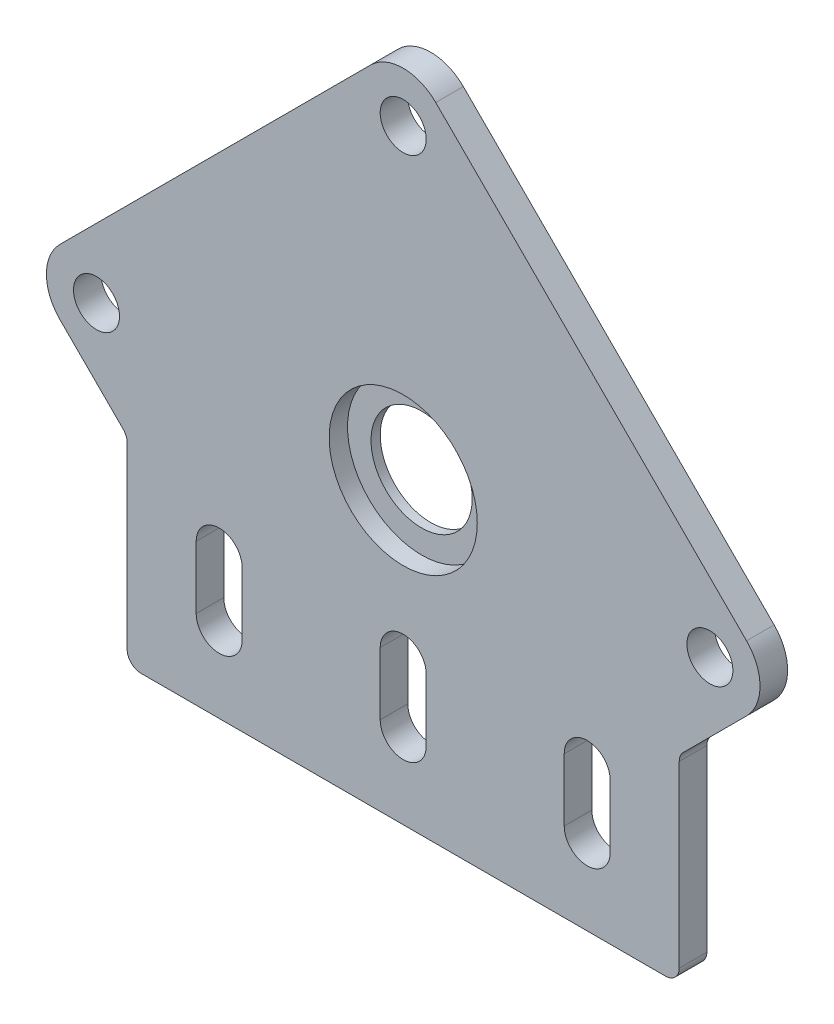
ISO-10303-21;
HEADER;
FILE_DESCRIPTION(('STEP AP214'),'2;1');
FILE_NAME('part.step','',(''),(''),'','','');
FILE_SCHEMA(('AUTOMOTIVE_DESIGN { 1 0 10303 214 1 1 1 1 }'));
ENDSEC;
DATA;
#1=APPLICATION_CONTEXT('core data for automotive mechanical design processes');
#2=APPLICATION_PROTOCOL_DEFINITION('international standard','automotive_design',2000,#1);
#3=PRODUCT_CONTEXT('',#1,'mechanical');
#4=PRODUCT('Part','Part','',(#3));
#5=PRODUCT_RELATED_PRODUCT_CATEGORY('part','',(#4));
#6=PRODUCT_DEFINITION_FORMATION('','',#4);
#7=PRODUCT_DEFINITION_CONTEXT('part definition',#1,'design');
#8=PRODUCT_DEFINITION('design','',#6,#7);
#9=PRODUCT_DEFINITION_SHAPE('','',#8);
#10=(LENGTH_UNIT() NAMED_UNIT(*) SI_UNIT(.MILLI.,.METRE.));
#11=(NAMED_UNIT(*) PLANE_ANGLE_UNIT() SI_UNIT($,.RADIAN.));
#12=(NAMED_UNIT(*) SI_UNIT($,.STERADIAN.) SOLID_ANGLE_UNIT());
#13=UNCERTAINTY_MEASURE_WITH_UNIT(LENGTH_MEASURE(1.E-05),#10,'distance_accuracy_value','');
#14=(GEOMETRIC_REPRESENTATION_CONTEXT(3) GLOBAL_UNCERTAINTY_ASSIGNED_CONTEXT((#13)) GLOBAL_UNIT_ASSIGNED_CONTEXT((#10,
#11,#12)) REPRESENTATION_CONTEXT('',''));
#15=CARTESIAN_POINT('',(0.,0.,0.));
#16=DIRECTION('',(0.,0.,1.));
#17=DIRECTION('',(1.,0.,0.));
#18=AXIS2_PLACEMENT_3D('',#15,#16,#17);
#19=CARTESIAN_POINT('',(0.,32.4299999999672,3.));
#20=DIRECTION('',(0.,0.,-1.));
#21=DIRECTION('',(-1.,0.,0.));
#22=AXIS2_PLACEMENT_3D('',#19,#20,#21);
#23=CYLINDRICAL_SURFACE('',#22,5.50000000000001);
#24=CARTESIAN_POINT('',(0.,32.4299999999672,0.));
#25=DIRECTION('',(0.,0.,1.));
#26=DIRECTION('',(1.,0.,0.));
#27=AXIS2_PLACEMENT_3D('',#24,#25,#26);
#28=CIRCLE('',#27,5.50000000000001);
#29=CARTESIAN_POINT('',(5.50000000000001,32.4299999999672,0.));
#30=VERTEX_POINT('',#29);
#31=EDGE_CURVE('E321',#30,#30,#28,.T.);
#32=ORIENTED_EDGE('',*,*,#31,.F.);
#33=EDGE_LOOP('',(#32));
#34=FACE_BOUND('',#33,.T.);
#35=CARTESIAN_POINT('',(0.,32.4299999999672,1.));
#36=DIRECTION('',(0.,0.,1.));
#37=DIRECTION('',(1.,0.,0.));
#38=AXIS2_PLACEMENT_3D('',#35,#36,#37);
#39=CIRCLE('',#38,5.50000000000001);
#40=CARTESIAN_POINT('',(5.50000000000001,32.4299999999672,1.));
#41=VERTEX_POINT('',#40);
#42=EDGE_CURVE('E36',#41,#41,#39,.T.);
#43=ORIENTED_EDGE('',*,*,#42,.T.);
#44=EDGE_LOOP('',(#43));
#45=FACE_BOUND('',#44,.T.);
#46=ADVANCED_FACE('F32',(#34,#45),#23,.F.);
#47=CARTESIAN_POINT('',(28.5000000000561,1.5,3.));
#48=DIRECTION('',(0.,0.,-1.));
#49=DIRECTION('',(-1.,0.,0.));
#50=AXIS2_PLACEMENT_3D('',#47,#48,#49);
#51=PLANE('',#50);
#52=CARTESIAN_POINT('',(0.,32.4299999999672,3.));
#53=DIRECTION('',(0.,0.,1.));
#54=DIRECTION('',(1.,0.,0.));
#55=AXIS2_PLACEMENT_3D('',#52,#53,#54);
#56=CIRCLE('',#55,8.05000000000959);
#57=CARTESIAN_POINT('',(8.05000000000959,32.4299999999672,3.));
#58=VERTEX_POINT('',#57);
#59=EDGE_CURVE('E803',#58,#58,#56,.T.);
#60=ORIENTED_EDGE('',*,*,#59,.F.);
#61=EDGE_LOOP('',(#60));
#62=FACE_BOUND('',#61,.T.);
#63=CARTESIAN_POINT('',(33.333,32.4299999999672,3.));
#64=DIRECTION('',(0.,0.,1.));
#65=DIRECTION('',(-1.,0.,0.));
#66=AXIS2_PLACEMENT_3D('',#63,#64,#65);
#67=CIRCLE('',#66,2.50000000000959);
#68=CARTESIAN_POINT('',(30.8329999999904,32.4299999999672,3.));
#69=VERTEX_POINT('',#68);
#70=EDGE_CURVE('E244',#69,#69,#67,.T.);
#71=ORIENTED_EDGE('',*,*,#70,.F.);
#72=EDGE_LOOP('',(#71));
#73=FACE_BOUND('',#72,.T.);
#74=CARTESIAN_POINT('',(-20.,8.63,3.));
#75=DIRECTION('',(0.,0.,1.));
#76=DIRECTION('',(1.,0.,0.));
#77=AXIS2_PLACEMENT_3D('',#74,#75,#76);
#78=CIRCLE('',#77,2.5);
#79=CARTESIAN_POINT('',(-22.5,8.63,3.));
#80=VERTEX_POINT('',#79);
#81=CARTESIAN_POINT('',(-17.5,8.63,3.));
#82=VERTEX_POINT('',#81);
#83=EDGE_CURVE('E250',#80,#82,#78,.T.);
#84=ORIENTED_EDGE('',*,*,#83,.F.);
#85=DIRECTION('',(0.,-1.,0.));
#86=VECTOR('',#85,1.);
#87=CARTESIAN_POINT('',(-22.5,8.63,3.));
#88=LINE('',#87,#86);
#89=CARTESIAN_POINT('',(-22.5,15.43,3.));
#90=VERTEX_POINT('',#89);
#91=EDGE_CURVE('E258',#90,#80,#88,.T.);
#92=ORIENTED_EDGE('',*,*,#91,.F.);
#93=CARTESIAN_POINT('',(-20.,15.43,3.));
#94=DIRECTION('',(0.,0.,1.));
#95=DIRECTION('',(1.,0.,0.));
#96=AXIS2_PLACEMENT_3D('',#93,#94,#95);
#97=CIRCLE('',#96,2.5);
#98=CARTESIAN_POINT('',(-17.5,15.43,3.));
#99=VERTEX_POINT('',#98);
#100=EDGE_CURVE('E255',#99,#90,#97,.T.);
#101=ORIENTED_EDGE('',*,*,#100,.F.);
#102=DIRECTION('',(0.,1.,0.));
#103=VECTOR('',#102,1.);
#104=CARTESIAN_POINT('',(-17.5,8.63,3.));
#105=LINE('',#104,#103);
#106=EDGE_CURVE('E252',#82,#99,#105,.T.);
#107=ORIENTED_EDGE('',*,*,#106,.F.);
#108=EDGE_LOOP('',(#84,#92,#101,#107));
#109=FACE_BOUND('',#108,.T.);
#110=CARTESIAN_POINT('',(-33.333,32.4299999999672,3.));
#111=DIRECTION('',(0.,0.,1.));
#112=DIRECTION('',(1.,0.,0.));
#113=AXIS2_PLACEMENT_3D('',#110,#111,#112);
#114=CIRCLE('',#113,2.50000000000959);
#115=CARTESIAN_POINT('',(-30.8329999999904,32.4299999999672,3.));
#116=VERTEX_POINT('',#115);
#117=EDGE_CURVE('E312',#116,#116,#114,.T.);
#118=ORIENTED_EDGE('',*,*,#117,.F.);
#119=EDGE_LOOP('',(#118));
#120=FACE_BOUND('',#119,.T.);
#121=CARTESIAN_POINT('',(0.,65.7630273303,3.));
#122=DIRECTION('',(0.,0.,1.));
#123=DIRECTION('',(1.,0.,0.));
#124=AXIS2_PLACEMENT_3D('',#121,#122,#123);
#125=CIRCLE('',#124,2.5);
#126=CARTESIAN_POINT('',(2.5,65.7630273303,3.));
#127=VERTEX_POINT('',#126);
#128=EDGE_CURVE('E318',#127,#127,#125,.T.);
#129=ORIENTED_EDGE('',*,*,#128,.F.);
#130=EDGE_LOOP('',(#129));
#131=FACE_BOUND('',#130,.T.);
#132=CARTESIAN_POINT('',(28.5000000000561,1.5,3.));
#133=DIRECTION('',(0.,0.,1.));
#134=DIRECTION('',(-1.,0.,0.));
#135=AXIS2_PLACEMENT_3D('',#132,#133,#134);
#136=CIRCLE('',#135,1.5);
#137=CARTESIAN_POINT('',(28.5000000000561,0.,3.));
#138=VERTEX_POINT('',#137);
#139=CARTESIAN_POINT('',(30.0000000000561,1.5,3.));
#140=VERTEX_POINT('',#139);
#141=EDGE_CURVE('E327',#138,#140,#136,.T.);
#142=ORIENTED_EDGE('',*,*,#141,.T.);
#143=DIRECTION('',(0.,1.,0.));
#144=VECTOR('',#143,1.);
#145=CARTESIAN_POINT('',(30.0000000000561,20.9591209072809,3.));
#146=LINE('',#145,#144);
#147=CARTESIAN_POINT('',(30.0000000000561,20.9591209072809,3.));
#148=VERTEX_POINT('',#147);
#149=EDGE_CURVE('E330',#140,#148,#146,.T.);
#150=ORIENTED_EDGE('',*,*,#149,.T.);
#151=CARTESIAN_POINT('',(31.5000000000561,20.9591209072809,3.));
#152=DIRECTION('',(0.,0.,-1.));
#153=DIRECTION('',(-1.,0.,0.));
#154=AXIS2_PLACEMENT_3D('',#151,#152,#153);
#155=CIRCLE('',#154,1.5);
#156=CARTESIAN_POINT('',(30.4393398282763,22.0197810790608,3.));
#157=VERTEX_POINT('',#156);
#158=EDGE_CURVE('E333',#148,#157,#155,.T.);
#159=ORIENTED_EDGE('',*,*,#158,.T.);
#160=DIRECTION('',(0.707106781186546,0.707106781186549,0.));
#161=VECTOR('',#160,1.);
#162=CARTESIAN_POINT('',(37.31402484325,28.8944660940345,3.));
#163=LINE('',#162,#161);
#164=CARTESIAN_POINT('',(37.31402484325,28.8944660940345,3.));
#165=VERTEX_POINT('',#164);
#166=EDGE_CURVE('E335',#157,#165,#163,.T.);
#167=ORIENTED_EDGE('',*,*,#166,.T.);
#168=CARTESIAN_POINT('',(33.7784909373173,32.4299999999672,3.));
#169=DIRECTION('',(0.,0.,1.));
#170=DIRECTION('',(-1.,0.,0.));
#171=AXIS2_PLACEMENT_3D('',#168,#169,#170);
#172=CIRCLE('',#171,4.99999999999998);
#173=CARTESIAN_POINT('',(37.31402484325,35.9655339058999,3.));
#174=VERTEX_POINT('',#173);
#175=EDGE_CURVE('E337',#165,#174,#172,.T.);
#176=ORIENTED_EDGE('',*,*,#175,.T.);
#177=DIRECTION('',(-0.707106781186547,0.707106781186548,0.));
#178=VECTOR('',#177,1.);
#179=CARTESIAN_POINT('',(3.53553390593274,69.7440248432172,3.));
#180=LINE('',#179,#178);
#181=CARTESIAN_POINT('',(3.53553390593274,69.7440248432172,3.));
#182=VERTEX_POINT('',#181);
#183=EDGE_CURVE('E339',#174,#182,#180,.T.);
#184=ORIENTED_EDGE('',*,*,#183,.T.);
#185=CARTESIAN_POINT('',(0.,66.2084909372845,3.));
#186=DIRECTION('',(0.,0.,1.));
#187=DIRECTION('',(1.,0.,0.));
#188=AXIS2_PLACEMENT_3D('',#185,#186,#187);
#189=CIRCLE('',#188,5.);
#190=CARTESIAN_POINT('',(-3.53553390593275,69.7440248432172,3.));
#191=VERTEX_POINT('',#190);
#192=EDGE_CURVE('E341',#182,#191,#189,.T.);
#193=ORIENTED_EDGE('',*,*,#192,.T.);
#194=DIRECTION('',(-0.707106781186547,-0.707106781186548,0.));
#195=VECTOR('',#194,1.);
#196=CARTESIAN_POINT('',(-3.53553390593276,69.7440248432172,3.));
#197=LINE('',#196,#195);
#198=CARTESIAN_POINT('',(-37.31402484325,35.9655339059,3.));
#199=VERTEX_POINT('',#198);
#200=EDGE_CURVE('E343',#191,#199,#197,.T.);
#201=ORIENTED_EDGE('',*,*,#200,.T.);
#202=CARTESIAN_POINT('',(-33.7784909373173,32.4299999999672,3.));
#203=DIRECTION('',(0.,0.,1.));
#204=DIRECTION('',(1.,0.,0.));
#205=AXIS2_PLACEMENT_3D('',#202,#203,#204);
#206=CIRCLE('',#205,4.99999999999999);
#207=CARTESIAN_POINT('',(-37.31402484325,28.8944660940345,3.));
#208=VERTEX_POINT('',#207);
#209=EDGE_CURVE('E345',#199,#208,#206,.T.);
#210=ORIENTED_EDGE('',*,*,#209,.T.);
#211=DIRECTION('',(0.707106781186548,-0.707106781186547,0.));
#212=VECTOR('',#211,1.);
#213=CARTESIAN_POINT('',(-37.31402484325,28.8944660940345,3.));
#214=LINE('',#213,#212);
#215=CARTESIAN_POINT('',(-30.4393398282763,22.0197810790608,3.));
#216=VERTEX_POINT('',#215);
#217=EDGE_CURVE('E347',#208,#216,#214,.T.);
#218=ORIENTED_EDGE('',*,*,#217,.T.);
#219=CARTESIAN_POINT('',(-31.5000000000561,20.9591209072809,3.));
#220=DIRECTION('',(0.,0.,-1.));
#221=DIRECTION('',(1.,0.,0.));
#222=AXIS2_PLACEMENT_3D('',#219,#220,#221);
#223=CIRCLE('',#222,1.5);
#224=CARTESIAN_POINT('',(-30.0000000000561,20.9591209072809,3.));
#225=VERTEX_POINT('',#224);
#226=EDGE_CURVE('E349',#216,#225,#223,.T.);
#227=ORIENTED_EDGE('',*,*,#226,.T.);
#228=DIRECTION('',(0.,-1.,0.));
#229=VECTOR('',#228,1.);
#230=CARTESIAN_POINT('',(-30.0000000000561,20.9591209072809,3.));
#231=LINE('',#230,#229);
#232=CARTESIAN_POINT('',(-30.0000000000561,1.5,3.));
#233=VERTEX_POINT('',#232);
#234=EDGE_CURVE('E351',#225,#233,#231,.T.);
#235=ORIENTED_EDGE('',*,*,#234,.T.);
#236=CARTESIAN_POINT('',(-28.5000000000561,1.5,3.));
#237=DIRECTION('',(0.,0.,1.));
#238=DIRECTION('',(1.,0.,0.));
#239=AXIS2_PLACEMENT_3D('',#236,#237,#238);
#240=CIRCLE('',#239,1.5);
#241=CARTESIAN_POINT('',(-28.5000000000561,0.,3.));
#242=VERTEX_POINT('',#241);
#243=EDGE_CURVE('E353',#233,#242,#240,.T.);
#244=ORIENTED_EDGE('',*,*,#243,.T.);
#245=DIRECTION('',(1.,0.,0.));
#246=VECTOR('',#245,1.);
#247=CARTESIAN_POINT('',(-28.5000000000561,0.,3.));
#248=LINE('',#247,#246);
#249=EDGE_CURVE('E355',#242,#138,#248,.T.);
#250=ORIENTED_EDGE('',*,*,#249,.T.);
#251=EDGE_LOOP('',(#142,#150,#159,#167,#176,#184,#193,#201,#210,#218,#227,#235,#244,#250));
#252=FACE_BOUND('',#251,.T.);
#253=CARTESIAN_POINT('',(20.,8.63,3.));
#254=DIRECTION('',(0.,0.,1.));
#255=DIRECTION('',(-1.,0.,0.));
#256=AXIS2_PLACEMENT_3D('',#253,#254,#255);
#257=CIRCLE('',#256,2.5);
#258=CARTESIAN_POINT('',(17.5,8.63,3.));
#259=VERTEX_POINT('',#258);
#260=CARTESIAN_POINT('',(22.5,8.63,3.));
#261=VERTEX_POINT('',#260);
#262=EDGE_CURVE('E281',#259,#261,#257,.T.);
#263=ORIENTED_EDGE('',*,*,#262,.F.);
#264=DIRECTION('',(0.,-1.,0.));
#265=VECTOR('',#264,1.);
#266=CARTESIAN_POINT('',(17.5,8.63,3.));
#267=LINE('',#266,#265);
#268=CARTESIAN_POINT('',(17.5,15.43,3.));
#269=VERTEX_POINT('',#268);
#270=EDGE_CURVE('E289',#269,#259,#267,.T.);
#271=ORIENTED_EDGE('',*,*,#270,.F.);
#272=CARTESIAN_POINT('',(20.,15.43,3.));
#273=DIRECTION('',(0.,0.,1.));
#274=DIRECTION('',(-1.,0.,0.));
#275=AXIS2_PLACEMENT_3D('',#272,#273,#274);
#276=CIRCLE('',#275,2.5);
#277=CARTESIAN_POINT('',(22.5,15.43,3.));
#278=VERTEX_POINT('',#277);
#279=EDGE_CURVE('E286',#278,#269,#276,.T.);
#280=ORIENTED_EDGE('',*,*,#279,.F.);
#281=DIRECTION('',(0.,1.,0.));
#282=VECTOR('',#281,1.);
#283=CARTESIAN_POINT('',(22.5,8.63,3.));
#284=LINE('',#283,#282);
#285=EDGE_CURVE('E283',#261,#278,#284,.T.);
#286=ORIENTED_EDGE('',*,*,#285,.F.);
#287=EDGE_LOOP('',(#263,#271,#280,#286));
#288=FACE_BOUND('',#287,.T.);
#289=CARTESIAN_POINT('',(0.,8.63,3.));
#290=DIRECTION('',(0.,0.,1.));
#291=DIRECTION('',(1.,0.,0.));
#292=AXIS2_PLACEMENT_3D('',#289,#290,#291);
#293=CIRCLE('',#292,2.5);
#294=CARTESIAN_POINT('',(-2.5,8.63,3.));
#295=VERTEX_POINT('',#294);
#296=CARTESIAN_POINT('',(2.5,8.63,3.));
#297=VERTEX_POINT('',#296);
#298=EDGE_CURVE('E206',#295,#297,#293,.T.);
#299=ORIENTED_EDGE('',*,*,#298,.F.);
#300=DIRECTION('',(0.,-1.,0.));
#301=VECTOR('',#300,1.);
#302=CARTESIAN_POINT('',(-2.5,8.63,3.));
#303=LINE('',#302,#301);
#304=CARTESIAN_POINT('',(-2.5,15.43,3.));
#305=VERTEX_POINT('',#304);
#306=EDGE_CURVE('E229',#305,#295,#303,.T.);
#307=ORIENTED_EDGE('',*,*,#306,.F.);
#308=CARTESIAN_POINT('',(0.,15.43,3.));
#309=DIRECTION('',(0.,0.,1.));
#310=DIRECTION('',(1.,0.,0.));
#311=AXIS2_PLACEMENT_3D('',#308,#309,#310);
#312=CIRCLE('',#311,2.5);
#313=CARTESIAN_POINT('',(2.5,15.43,3.));
#314=VERTEX_POINT('',#313);
#315=EDGE_CURVE('E227',#314,#305,#312,.T.);
#316=ORIENTED_EDGE('',*,*,#315,.F.);
#317=DIRECTION('',(0.,1.,0.));
#318=VECTOR('',#317,1.);
#319=CARTESIAN_POINT('',(2.5,8.63,3.));
#320=LINE('',#319,#318);
#321=EDGE_CURVE('E214',#297,#314,#320,.T.);
#322=ORIENTED_EDGE('',*,*,#321,.F.);
#323=EDGE_LOOP('',(#299,#307,#316,#322));
#324=FACE_BOUND('',#323,.T.);
#325=ADVANCED_FACE('F226',(#62,#73,#109,#120,#131,#252,#288,#324),#51,.F.);
#326=CARTESIAN_POINT('',(28.5000000000561,1.5,0.));
#327=DIRECTION('',(0.,0.,-1.));
#328=DIRECTION('',(-1.,0.,0.));
#329=AXIS2_PLACEMENT_3D('',#326,#327,#328);
#330=PLANE('',#329);
#331=DIRECTION('',(0.,-1.,0.));
#332=VECTOR('',#331,1.);
#333=CARTESIAN_POINT('',(-22.5,8.63,0.));
#334=LINE('',#333,#332);
#335=CARTESIAN_POINT('',(-22.5,15.43,0.));
#336=VERTEX_POINT('',#335);
#337=CARTESIAN_POINT('',(-22.5,8.63,0.));
#338=VERTEX_POINT('',#337);
#339=EDGE_CURVE('E253',#336,#338,#334,.T.);
#340=ORIENTED_EDGE('',*,*,#339,.T.);
#341=CARTESIAN_POINT('',(-20.,8.63,0.));
#342=DIRECTION('',(0.,0.,1.));
#343=DIRECTION('',(1.,0.,0.));
#344=AXIS2_PLACEMENT_3D('',#341,#342,#343);
#345=CIRCLE('',#344,2.5);
#346=CARTESIAN_POINT('',(-17.5,8.63,0.));
#347=VERTEX_POINT('',#346);
#348=EDGE_CURVE('E247',#338,#347,#345,.T.);
#349=ORIENTED_EDGE('',*,*,#348,.T.);
#350=DIRECTION('',(0.,1.,0.));
#351=VECTOR('',#350,1.);
#352=CARTESIAN_POINT('',(-17.5,8.63,0.));
#353=LINE('',#352,#351);
#354=CARTESIAN_POINT('',(-17.5,15.43,0.));
#355=VERTEX_POINT('',#354);
#356=EDGE_CURVE('E263',#347,#355,#353,.T.);
#357=ORIENTED_EDGE('',*,*,#356,.T.);
#358=CARTESIAN_POINT('',(-20.,15.43,0.));
#359=DIRECTION('',(0.,0.,1.));
#360=DIRECTION('',(1.,0.,0.));
#361=AXIS2_PLACEMENT_3D('',#358,#359,#360);
#362=CIRCLE('',#361,2.5);
#363=EDGE_CURVE('E266',#355,#336,#362,.T.);
#364=ORIENTED_EDGE('',*,*,#363,.T.);
#365=EDGE_LOOP('',(#340,#349,#357,#364));
#366=FACE_BOUND('',#365,.T.);
#367=DIRECTION('',(0.,-1.,0.));
#368=VECTOR('',#367,1.);
#369=CARTESIAN_POINT('',(17.5,8.63,0.));
#370=LINE('',#369,#368);
#371=CARTESIAN_POINT('',(17.5,15.43,0.));
#372=VERTEX_POINT('',#371);
#373=CARTESIAN_POINT('',(17.5,8.63,0.));
#374=VERTEX_POINT('',#373);
#375=EDGE_CURVE('E284',#372,#374,#370,.T.);
#376=ORIENTED_EDGE('',*,*,#375,.T.);
#377=CARTESIAN_POINT('',(20.,8.63,0.));
#378=DIRECTION('',(0.,0.,1.));
#379=DIRECTION('',(-1.,0.,0.));
#380=AXIS2_PLACEMENT_3D('',#377,#378,#379);
#381=CIRCLE('',#380,2.5);
#382=CARTESIAN_POINT('',(22.5,8.63,0.));
#383=VERTEX_POINT('',#382);
#384=EDGE_CURVE('E280',#374,#383,#381,.T.);
#385=ORIENTED_EDGE('',*,*,#384,.T.);
#386=DIRECTION('',(0.,1.,0.));
#387=VECTOR('',#386,1.);
#388=CARTESIAN_POINT('',(22.5,8.63,0.));
#389=LINE('',#388,#387);
#390=CARTESIAN_POINT('',(22.5,15.43,0.));
#391=VERTEX_POINT('',#390);
#392=EDGE_CURVE('E294',#383,#391,#389,.T.);
#393=ORIENTED_EDGE('',*,*,#392,.T.);
#394=CARTESIAN_POINT('',(20.,15.43,0.));
#395=DIRECTION('',(0.,0.,1.));
#396=DIRECTION('',(-1.,0.,0.));
#397=AXIS2_PLACEMENT_3D('',#394,#395,#396);
#398=CIRCLE('',#397,2.5);
#399=EDGE_CURVE('E297',#391,#372,#398,.T.);
#400=ORIENTED_EDGE('',*,*,#399,.T.);
#401=EDGE_LOOP('',(#376,#385,#393,#400));
#402=FACE_BOUND('',#401,.T.);
#403=CARTESIAN_POINT('',(-33.333,32.4299999999672,0.));
#404=DIRECTION('',(0.,0.,1.));
#405=DIRECTION('',(1.,0.,0.));
#406=AXIS2_PLACEMENT_3D('',#403,#404,#405);
#407=CIRCLE('',#406,2.50000000000959);
#408=CARTESIAN_POINT('',(-30.8329999999904,32.4299999999672,0.));
#409=VERTEX_POINT('',#408);
#410=EDGE_CURVE('E311',#409,#409,#407,.T.);
#411=ORIENTED_EDGE('',*,*,#410,.T.);
#412=EDGE_LOOP('',(#411));
#413=FACE_BOUND('',#412,.T.);
#414=ORIENTED_EDGE('',*,*,#31,.T.);
#415=EDGE_LOOP('',(#414));
#416=FACE_BOUND('',#415,.T.);
#417=CARTESIAN_POINT('',(28.5000000000561,1.5,0.));
#418=DIRECTION('',(0.,0.,1.));
#419=DIRECTION('',(-1.,0.,0.));
#420=AXIS2_PLACEMENT_3D('',#417,#418,#419);
#421=CIRCLE('',#420,1.5);
#422=CARTESIAN_POINT('',(28.5000000000561,0.,0.));
#423=VERTEX_POINT('',#422);
#424=CARTESIAN_POINT('',(30.0000000000561,1.5,0.));
#425=VERTEX_POINT('',#424);
#426=EDGE_CURVE('E326',#423,#425,#421,.T.);
#427=ORIENTED_EDGE('',*,*,#426,.F.);
#428=DIRECTION('',(1.,0.,0.));
#429=VECTOR('',#428,1.);
#430=CARTESIAN_POINT('',(-28.5000000000561,0.,0.));
#431=LINE('',#430,#429);
#432=CARTESIAN_POINT('',(-28.5000000000561,0.,0.));
#433=VERTEX_POINT('',#432);
#434=EDGE_CURVE('E331',#433,#423,#431,.T.);
#435=ORIENTED_EDGE('',*,*,#434,.F.);
#436=CARTESIAN_POINT('',(-28.5000000000561,1.5,0.));
#437=DIRECTION('',(0.,0.,1.));
#438=DIRECTION('',(1.,0.,0.));
#439=AXIS2_PLACEMENT_3D('',#436,#437,#438);
#440=CIRCLE('',#439,1.5);
#441=CARTESIAN_POINT('',(-30.0000000000561,1.5,0.));
#442=VERTEX_POINT('',#441);
#443=EDGE_CURVE('E382',#442,#433,#440,.T.);
#444=ORIENTED_EDGE('',*,*,#443,.F.);
#445=DIRECTION('',(0.,-1.,0.));
#446=VECTOR('',#445,1.);
#447=CARTESIAN_POINT('',(-30.0000000000561,20.9591209072809,0.));
#448=LINE('',#447,#446);
#449=CARTESIAN_POINT('',(-30.0000000000561,20.9591209072809,0.));
#450=VERTEX_POINT('',#449);
#451=EDGE_CURVE('E380',#450,#442,#448,.T.);
#452=ORIENTED_EDGE('',*,*,#451,.F.);
#453=CARTESIAN_POINT('',(-31.5000000000561,20.9591209072809,0.));
#454=DIRECTION('',(0.,0.,-1.));
#455=DIRECTION('',(1.,0.,0.));
#456=AXIS2_PLACEMENT_3D('',#453,#454,#455);
#457=CIRCLE('',#456,1.5);
#458=CARTESIAN_POINT('',(-30.4393398282763,22.0197810790608,0.));
#459=VERTEX_POINT('',#458);
#460=EDGE_CURVE('E378',#459,#450,#457,.T.);
#461=ORIENTED_EDGE('',*,*,#460,.F.);
#462=DIRECTION('',(0.707106781186548,-0.707106781186547,0.));
#463=VECTOR('',#462,1.);
#464=CARTESIAN_POINT('',(-37.31402484325,28.8944660940345,0.));
#465=LINE('',#464,#463);
#466=CARTESIAN_POINT('',(-37.31402484325,28.8944660940345,0.));
#467=VERTEX_POINT('',#466);
#468=EDGE_CURVE('E376',#467,#459,#465,.T.);
#469=ORIENTED_EDGE('',*,*,#468,.F.);
#470=CARTESIAN_POINT('',(-33.7784909373173,32.4299999999672,0.));
#471=DIRECTION('',(0.,0.,1.));
#472=DIRECTION('',(1.,0.,0.));
#473=AXIS2_PLACEMENT_3D('',#470,#471,#472);
#474=CIRCLE('',#473,4.99999999999999);
#475=CARTESIAN_POINT('',(-37.31402484325,35.9655339059,0.));
#476=VERTEX_POINT('',#475);
#477=EDGE_CURVE('E374',#476,#467,#474,.T.);
#478=ORIENTED_EDGE('',*,*,#477,.F.);
#479=DIRECTION('',(-0.707106781186547,-0.707106781186548,0.));
#480=VECTOR('',#479,1.);
#481=CARTESIAN_POINT('',(-3.53553390593276,69.7440248432172,0.));
#482=LINE('',#481,#480);
#483=CARTESIAN_POINT('',(-3.53553390593275,69.7440248432172,0.));
#484=VERTEX_POINT('',#483);
#485=EDGE_CURVE('E372',#484,#476,#482,.T.);
#486=ORIENTED_EDGE('',*,*,#485,.F.);
#487=CARTESIAN_POINT('',(0.,66.2084909372845,0.));
#488=DIRECTION('',(0.,0.,1.));
#489=DIRECTION('',(1.,0.,0.));
#490=AXIS2_PLACEMENT_3D('',#487,#488,#489);
#491=CIRCLE('',#490,5.);
#492=CARTESIAN_POINT('',(3.53553390593274,69.7440248432172,0.));
#493=VERTEX_POINT('',#492);
#494=EDGE_CURVE('E370',#493,#484,#491,.T.);
#495=ORIENTED_EDGE('',*,*,#494,.F.);
#496=DIRECTION('',(-0.707106781186547,0.707106781186548,0.));
#497=VECTOR('',#496,1.);
#498=CARTESIAN_POINT('',(3.53553390593274,69.7440248432172,0.));
#499=LINE('',#498,#497);
#500=CARTESIAN_POINT('',(37.31402484325,35.9655339058999,0.));
#501=VERTEX_POINT('',#500);
#502=EDGE_CURVE('E368',#501,#493,#499,.T.);
#503=ORIENTED_EDGE('',*,*,#502,.F.);
#504=CARTESIAN_POINT('',(33.7784909373173,32.4299999999672,0.));
#505=DIRECTION('',(0.,0.,1.));
#506=DIRECTION('',(-1.,0.,0.));
#507=AXIS2_PLACEMENT_3D('',#504,#505,#506);
#508=CIRCLE('',#507,4.99999999999998);
#509=CARTESIAN_POINT('',(37.31402484325,28.8944660940345,0.));
#510=VERTEX_POINT('',#509);
#511=EDGE_CURVE('E366',#510,#501,#508,.T.);
#512=ORIENTED_EDGE('',*,*,#511,.F.);
#513=DIRECTION('',(0.707106781186546,0.707106781186549,0.));
#514=VECTOR('',#513,1.);
#515=CARTESIAN_POINT('',(37.31402484325,28.8944660940345,0.));
#516=LINE('',#515,#514);
#517=CARTESIAN_POINT('',(30.4393398282763,22.0197810790608,0.));
#518=VERTEX_POINT('',#517);
#519=EDGE_CURVE('E364',#518,#510,#516,.T.);
#520=ORIENTED_EDGE('',*,*,#519,.F.);
#521=CARTESIAN_POINT('',(31.5000000000561,20.9591209072809,0.));
#522=DIRECTION('',(0.,0.,-1.));
#523=DIRECTION('',(-1.,0.,0.));
#524=AXIS2_PLACEMENT_3D('',#521,#522,#523);
#525=CIRCLE('',#524,1.5);
#526=CARTESIAN_POINT('',(30.0000000000561,20.9591209072809,0.));
#527=VERTEX_POINT('',#526);
#528=EDGE_CURVE('E362',#527,#518,#525,.T.);
#529=ORIENTED_EDGE('',*,*,#528,.F.);
#530=DIRECTION('',(0.,1.,0.));
#531=VECTOR('',#530,1.);
#532=CARTESIAN_POINT('',(30.0000000000561,20.9591209072809,0.));
#533=LINE('',#532,#531);
#534=EDGE_CURVE('E360',#425,#527,#533,.T.);
#535=ORIENTED_EDGE('',*,*,#534,.F.);
#536=EDGE_LOOP('',(#427,#435,#444,#452,#461,#469,#478,#486,#495,#503,#512,#520,#529,#535));
#537=FACE_BOUND('',#536,.T.);
#538=CARTESIAN_POINT('',(0.,65.7630273303,0.));
#539=DIRECTION('',(0.,0.,1.));
#540=DIRECTION('',(1.,0.,0.));
#541=AXIS2_PLACEMENT_3D('',#538,#539,#540);
#542=CIRCLE('',#541,2.5);
#543=CARTESIAN_POINT('',(2.5,65.7630273303,0.));
#544=VERTEX_POINT('',#543);
#545=EDGE_CURVE('E315',#544,#544,#542,.T.);
#546=ORIENTED_EDGE('',*,*,#545,.T.);
#547=EDGE_LOOP('',(#546));
#548=FACE_BOUND('',#547,.T.);
#549=CARTESIAN_POINT('',(33.333,32.4299999999672,0.));
#550=DIRECTION('',(0.,0.,1.));
#551=DIRECTION('',(-1.,0.,0.));
#552=AXIS2_PLACEMENT_3D('',#549,#550,#551);
#553=CIRCLE('',#552,2.50000000000959);
#554=CARTESIAN_POINT('',(30.8329999999904,32.4299999999672,0.));
#555=VERTEX_POINT('',#554);
#556=EDGE_CURVE('E222',#555,#555,#553,.T.);
#557=ORIENTED_EDGE('',*,*,#556,.T.);
#558=EDGE_LOOP('',(#557));
#559=FACE_BOUND('',#558,.T.);
#560=DIRECTION('',(0.,-1.,0.));
#561=VECTOR('',#560,1.);
#562=CARTESIAN_POINT('',(-2.5,8.63,0.));
#563=LINE('',#562,#561);
#564=CARTESIAN_POINT('',(-2.5,15.43,0.));
#565=VERTEX_POINT('',#564);
#566=CARTESIAN_POINT('',(-2.5,8.63,0.));
#567=VERTEX_POINT('',#566);
#568=EDGE_CURVE('E215',#565,#567,#563,.T.);
#569=ORIENTED_EDGE('',*,*,#568,.T.);
#570=CARTESIAN_POINT('',(0.,8.63,0.));
#571=DIRECTION('',(0.,0.,1.));
#572=DIRECTION('',(1.,0.,0.));
#573=AXIS2_PLACEMENT_3D('',#570,#571,#572);
#574=CIRCLE('',#573,2.5);
#575=CARTESIAN_POINT('',(2.5,8.63,0.));
#576=VERTEX_POINT('',#575);
#577=EDGE_CURVE('E56',#567,#576,#574,.T.);
#578=ORIENTED_EDGE('',*,*,#577,.T.);
#579=DIRECTION('',(0.,1.,0.));
#580=VECTOR('',#579,1.);
#581=CARTESIAN_POINT('',(2.5,8.63,0.));
#582=LINE('',#581,#580);
#583=CARTESIAN_POINT('',(2.5,15.43,0.));
#584=VERTEX_POINT('',#583);
#585=EDGE_CURVE('E221',#576,#584,#582,.T.);
#586=ORIENTED_EDGE('',*,*,#585,.T.);
#587=CARTESIAN_POINT('',(0.,15.43,0.));
#588=DIRECTION('',(0.,0.,1.));
#589=DIRECTION('',(1.,0.,0.));
#590=AXIS2_PLACEMENT_3D('',#587,#588,#589);
#591=CIRCLE('',#590,2.5);
#592=EDGE_CURVE('E236',#584,#565,#591,.T.);
#593=ORIENTED_EDGE('',*,*,#592,.T.);
#594=EDGE_LOOP('',(#569,#578,#586,#593));
#595=FACE_BOUND('',#594,.T.);
#596=ADVANCED_FACE('F431',(#366,#402,#413,#416,#537,#548,#559,#595),#330,.T.);
#597=CARTESIAN_POINT('',(28.5000000000561,1.5,3.));
#598=DIRECTION('',(0.,0.,-1.));
#599=DIRECTION('',(-1.,0.,0.));
#600=AXIS2_PLACEMENT_3D('',#597,#598,#599);
#601=CYLINDRICAL_SURFACE('',#600,1.5);
#602=ORIENTED_EDGE('',*,*,#426,.T.);
#603=DIRECTION('',(0.,0.,-1.));
#604=VECTOR('',#603,1.);
#605=CARTESIAN_POINT('',(30.0000000000561,1.5,3.));
#606=LINE('',#605,#604);
#607=EDGE_CURVE('E11',#140,#425,#606,.T.);
#608=ORIENTED_EDGE('',*,*,#607,.F.);
#609=ORIENTED_EDGE('',*,*,#141,.F.);
#610=DIRECTION('',(0.,0.,-1.));
#611=VECTOR('',#610,1.);
#612=CARTESIAN_POINT('',(28.5000000000561,0.,3.));
#613=LINE('',#612,#611);
#614=EDGE_CURVE('E357',#138,#423,#613,.T.);
#615=ORIENTED_EDGE('',*,*,#614,.T.);
#616=EDGE_LOOP('',(#602,#608,#609,#615));
#617=FACE_BOUND('',#616,.T.);
#618=ADVANCED_FACE('F34',(#617),#601,.T.);
#619=CARTESIAN_POINT('',(30.0000000000561,20.9591209072809,3.));
#620=DIRECTION('',(-1.,0.,0.));
#621=DIRECTION('',(0.,-1.,0.));
#622=AXIS2_PLACEMENT_3D('',#619,#620,#621);
#623=PLANE('',#622);
#624=ORIENTED_EDGE('',*,*,#534,.T.);
#625=DIRECTION('',(0.,0.,-1.));
#626=VECTOR('',#625,1.);
#627=CARTESIAN_POINT('',(30.0000000000561,20.9591209072809,3.));
#628=LINE('',#627,#626);
#629=EDGE_CURVE('E41',#148,#527,#628,.T.);
#630=ORIENTED_EDGE('',*,*,#629,.F.);
#631=ORIENTED_EDGE('',*,*,#149,.F.);
#632=ORIENTED_EDGE('',*,*,#607,.T.);
#633=EDGE_LOOP('',(#624,#630,#631,#632));
#634=FACE_BOUND('',#633,.T.);
#635=ADVANCED_FACE('F449',(#634),#623,.F.);
#636=CARTESIAN_POINT('',(31.5000000000561,20.9591209072809,3.));
#637=DIRECTION('',(0.,0.,-1.));
#638=DIRECTION('',(-1.,0.,0.));
#639=AXIS2_PLACEMENT_3D('',#636,#637,#638);
#640=CYLINDRICAL_SURFACE('',#639,1.5);
#641=ORIENTED_EDGE('',*,*,#528,.T.);
#642=DIRECTION('',(0.,0.,-1.));
#643=VECTOR('',#642,1.);
#644=CARTESIAN_POINT('',(30.4393398282763,22.0197810790608,3.));
#645=LINE('',#644,#643);
#646=EDGE_CURVE('E417',#157,#518,#645,.T.);
#647=ORIENTED_EDGE('',*,*,#646,.F.);
#648=ORIENTED_EDGE('',*,*,#158,.F.);
#649=ORIENTED_EDGE('',*,*,#629,.T.);
#650=EDGE_LOOP('',(#641,#647,#648,#649));
#651=FACE_BOUND('',#650,.T.);
#652=ADVANCED_FACE('F425',(#651),#640,.F.);
#653=CARTESIAN_POINT('',(37.31402484325,28.8944660940345,3.));
#654=DIRECTION('',(-0.707106781186549,0.707106781186546,0.));
#655=DIRECTION('',(-0.707106781186546,-0.707106781186549,0.));
#656=AXIS2_PLACEMENT_3D('',#653,#654,#655);
#657=PLANE('',#656);
#658=ORIENTED_EDGE('',*,*,#519,.T.);
#659=DIRECTION('',(0.,0.,-1.));
#660=VECTOR('',#659,1.);
#661=CARTESIAN_POINT('',(37.31402484325,28.8944660940345,3.));
#662=LINE('',#661,#660);
#663=EDGE_CURVE('E414',#165,#510,#662,.T.);
#664=ORIENTED_EDGE('',*,*,#663,.F.);
#665=ORIENTED_EDGE('',*,*,#166,.F.);
#666=ORIENTED_EDGE('',*,*,#646,.T.);
#667=EDGE_LOOP('',(#658,#664,#665,#666));
#668=FACE_BOUND('',#667,.T.);
#669=ADVANCED_FACE('F437',(#668),#657,.F.);
#670=CARTESIAN_POINT('',(33.7784909373173,32.4299999999672,3.));
#671=DIRECTION('',(0.,0.,-1.));
#672=DIRECTION('',(-1.,0.,0.));
#673=AXIS2_PLACEMENT_3D('',#670,#671,#672);
#674=CYLINDRICAL_SURFACE('',#673,4.99999999999998);
#675=ORIENTED_EDGE('',*,*,#511,.T.);
#676=DIRECTION('',(0.,0.,-1.));
#677=VECTOR('',#676,1.);
#678=CARTESIAN_POINT('',(37.31402484325,35.9655339058999,3.));
#679=LINE('',#678,#677);
#680=EDGE_CURVE('E411',#174,#501,#679,.T.);
#681=ORIENTED_EDGE('',*,*,#680,.F.);
#682=ORIENTED_EDGE('',*,*,#175,.F.);
#683=ORIENTED_EDGE('',*,*,#663,.T.);
#684=EDGE_LOOP('',(#675,#681,#682,#683));
#685=FACE_BOUND('',#684,.T.);
#686=ADVANCED_FACE('F441',(#685),#674,.T.);
#687=CARTESIAN_POINT('',(3.53553390593274,69.7440248432172,3.));
#688=DIRECTION('',(-0.707106781186548,-0.707106781186547,0.));
#689=DIRECTION('',(0.707106781186547,-0.707106781186548,0.));
#690=AXIS2_PLACEMENT_3D('',#687,#688,#689);
#691=PLANE('',#690);
#692=ORIENTED_EDGE('',*,*,#502,.T.);
#693=DIRECTION('',(0.,0.,-1.));
#694=VECTOR('',#693,1.);
#695=CARTESIAN_POINT('',(3.53553390593274,69.7440248432172,3.));
#696=LINE('',#695,#694);
#697=EDGE_CURVE('E408',#182,#493,#696,.T.);
#698=ORIENTED_EDGE('',*,*,#697,.F.);
#699=ORIENTED_EDGE('',*,*,#183,.F.);
#700=ORIENTED_EDGE('',*,*,#680,.T.);
#701=EDGE_LOOP('',(#692,#698,#699,#700));
#702=FACE_BOUND('',#701,.T.);
#703=ADVANCED_FACE('F492',(#702),#691,.F.);
#704=CARTESIAN_POINT('',(0.,66.2084909372845,3.));
#705=DIRECTION('',(0.,0.,-1.));
#706=DIRECTION('',(-1.,0.,0.));
#707=AXIS2_PLACEMENT_3D('',#704,#705,#706);
#708=CYLINDRICAL_SURFACE('',#707,5.);
#709=ORIENTED_EDGE('',*,*,#494,.T.);
#710=DIRECTION('',(0.,0.,-1.));
#711=VECTOR('',#710,1.);
#712=CARTESIAN_POINT('',(-3.53553390593275,69.7440248432172,3.));
#713=LINE('',#712,#711);
#714=EDGE_CURVE('E405',#191,#484,#713,.T.);
#715=ORIENTED_EDGE('',*,*,#714,.F.);
#716=ORIENTED_EDGE('',*,*,#192,.F.);
#717=ORIENTED_EDGE('',*,*,#697,.T.);
#718=EDGE_LOOP('',(#709,#715,#716,#717));
#719=FACE_BOUND('',#718,.T.);
#720=ADVANCED_FACE('F490',(#719),#708,.T.);
#721=CARTESIAN_POINT('',(-3.53553390593276,69.7440248432172,3.));
#722=DIRECTION('',(0.707106781186548,-0.707106781186547,0.));
#723=DIRECTION('',(0.707106781186547,0.707106781186548,0.));
#724=AXIS2_PLACEMENT_3D('',#721,#722,#723);
#725=PLANE('',#724);
#726=ORIENTED_EDGE('',*,*,#485,.T.);
#727=DIRECTION('',(0.,0.,-1.));
#728=VECTOR('',#727,1.);
#729=CARTESIAN_POINT('',(-37.31402484325,35.9655339059,3.));
#730=LINE('',#729,#728);
#731=EDGE_CURVE('E402',#199,#476,#730,.T.);
#732=ORIENTED_EDGE('',*,*,#731,.F.);
#733=ORIENTED_EDGE('',*,*,#200,.F.);
#734=ORIENTED_EDGE('',*,*,#714,.T.);
#735=EDGE_LOOP('',(#726,#732,#733,#734));
#736=FACE_BOUND('',#735,.T.);
#737=ADVANCED_FACE('F485',(#736),#725,.F.);
#738=CARTESIAN_POINT('',(-33.7784909373173,32.4299999999672,3.));
#739=DIRECTION('',(0.,0.,-1.));
#740=DIRECTION('',(-1.,0.,0.));
#741=AXIS2_PLACEMENT_3D('',#738,#739,#740);
#742=CYLINDRICAL_SURFACE('',#741,4.99999999999999);
#743=ORIENTED_EDGE('',*,*,#477,.T.);
#744=DIRECTION('',(0.,0.,-1.));
#745=VECTOR('',#744,1.);
#746=CARTESIAN_POINT('',(-37.31402484325,28.8944660940345,3.));
#747=LINE('',#746,#745);
#748=EDGE_CURVE('E399',#208,#467,#747,.T.);
#749=ORIENTED_EDGE('',*,*,#748,.F.);
#750=ORIENTED_EDGE('',*,*,#209,.F.);
#751=ORIENTED_EDGE('',*,*,#731,.T.);
#752=EDGE_LOOP('',(#743,#749,#750,#751));
#753=FACE_BOUND('',#752,.T.);
#754=ADVANCED_FACE('F480',(#753),#742,.T.);
#755=CARTESIAN_POINT('',(-37.31402484325,28.8944660940345,3.));
#756=DIRECTION('',(0.707106781186547,0.707106781186548,0.));
#757=DIRECTION('',(-0.707106781186548,0.707106781186547,0.));
#758=AXIS2_PLACEMENT_3D('',#755,#756,#757);
#759=PLANE('',#758);
#760=ORIENTED_EDGE('',*,*,#468,.T.);
#761=DIRECTION('',(0.,0.,-1.));
#762=VECTOR('',#761,1.);
#763=CARTESIAN_POINT('',(-30.4393398282763,22.0197810790608,3.));
#764=LINE('',#763,#762);
#765=EDGE_CURVE('E396',#216,#459,#764,.T.);
#766=ORIENTED_EDGE('',*,*,#765,.F.);
#767=ORIENTED_EDGE('',*,*,#217,.F.);
#768=ORIENTED_EDGE('',*,*,#748,.T.);
#769=EDGE_LOOP('',(#760,#766,#767,#768));
#770=FACE_BOUND('',#769,.T.);
#771=ADVANCED_FACE('F476',(#770),#759,.F.);
#772=CARTESIAN_POINT('',(-31.5000000000561,20.9591209072809,3.));
#773=DIRECTION('',(0.,0.,-1.));
#774=DIRECTION('',(-1.,0.,0.));
#775=AXIS2_PLACEMENT_3D('',#772,#773,#774);
#776=CYLINDRICAL_SURFACE('',#775,1.5);
#777=ORIENTED_EDGE('',*,*,#460,.T.);
#778=DIRECTION('',(0.,0.,-1.));
#779=VECTOR('',#778,1.);
#780=CARTESIAN_POINT('',(-30.0000000000561,20.9591209072809,3.));
#781=LINE('',#780,#779);
#782=EDGE_CURVE('E393',#225,#450,#781,.T.);
#783=ORIENTED_EDGE('',*,*,#782,.F.);
#784=ORIENTED_EDGE('',*,*,#226,.F.);
#785=ORIENTED_EDGE('',*,*,#765,.T.);
#786=EDGE_LOOP('',(#777,#783,#784,#785));
#787=FACE_BOUND('',#786,.T.);
#788=ADVANCED_FACE('F471',(#787),#776,.F.);
#789=CARTESIAN_POINT('',(-30.0000000000561,20.9591209072809,3.));
#790=DIRECTION('',(1.,0.,0.));
#791=DIRECTION('',(0.,1.,0.));
#792=AXIS2_PLACEMENT_3D('',#789,#790,#791);
#793=PLANE('',#792);
#794=ORIENTED_EDGE('',*,*,#451,.T.);
#795=DIRECTION('',(0.,0.,-1.));
#796=VECTOR('',#795,1.);
#797=CARTESIAN_POINT('',(-30.0000000000561,1.5,3.));
#798=LINE('',#797,#796);
#799=EDGE_CURVE('E390',#233,#442,#798,.T.);
#800=ORIENTED_EDGE('',*,*,#799,.F.);
#801=ORIENTED_EDGE('',*,*,#234,.F.);
#802=ORIENTED_EDGE('',*,*,#782,.T.);
#803=EDGE_LOOP('',(#794,#800,#801,#802));
#804=FACE_BOUND('',#803,.T.);
#805=ADVANCED_FACE('F465',(#804),#793,.F.);
#806=CARTESIAN_POINT('',(-28.5000000000561,1.5,3.));
#807=DIRECTION('',(0.,0.,-1.));
#808=DIRECTION('',(-1.,0.,0.));
#809=AXIS2_PLACEMENT_3D('',#806,#807,#808);
#810=CYLINDRICAL_SURFACE('',#809,1.5);
#811=ORIENTED_EDGE('',*,*,#443,.T.);
#812=DIRECTION('',(0.,0.,-1.));
#813=VECTOR('',#812,1.);
#814=CARTESIAN_POINT('',(-28.5000000000561,0.,3.));
#815=LINE('',#814,#813);
#816=EDGE_CURVE('E387',#242,#433,#815,.T.);
#817=ORIENTED_EDGE('',*,*,#816,.F.);
#818=ORIENTED_EDGE('',*,*,#243,.F.);
#819=ORIENTED_EDGE('',*,*,#799,.T.);
#820=EDGE_LOOP('',(#811,#817,#818,#819));
#821=FACE_BOUND('',#820,.T.);
#822=ADVANCED_FACE('F461',(#821),#810,.T.);
#823=CARTESIAN_POINT('',(-28.5000000000561,0.,3.));
#824=DIRECTION('',(0.,1.,0.));
#825=DIRECTION('',(0.,0.,1.));
#826=AXIS2_PLACEMENT_3D('',#823,#824,#825);
#827=PLANE('',#826);
#828=ORIENTED_EDGE('',*,*,#434,.T.);
#829=ORIENTED_EDGE('',*,*,#614,.F.);
#830=ORIENTED_EDGE('',*,*,#249,.F.);
#831=ORIENTED_EDGE('',*,*,#816,.T.);
#832=EDGE_LOOP('',(#828,#829,#830,#831));
#833=FACE_BOUND('',#832,.T.);
#834=ADVANCED_FACE('F456',(#833),#827,.F.);
#835=CARTESIAN_POINT('',(0.,65.7630273303,3.));
#836=DIRECTION('',(0.,0.,-1.));
#837=DIRECTION('',(-1.,0.,0.));
#838=AXIS2_PLACEMENT_3D('',#835,#836,#837);
#839=CYLINDRICAL_SURFACE('',#838,2.5);
#840=ORIENTED_EDGE('',*,*,#128,.T.);
#841=EDGE_LOOP('',(#840));
#842=FACE_BOUND('',#841,.T.);
#843=ORIENTED_EDGE('',*,*,#545,.F.);
#844=EDGE_LOOP('',(#843));
#845=FACE_BOUND('',#844,.T.);
#846=ADVANCED_FACE('F512',(#842,#845),#839,.F.);
#847=CARTESIAN_POINT('',(-33.333,32.4299999999672,3.));
#848=DIRECTION('',(0.,0.,-1.));
#849=DIRECTION('',(-1.,0.,0.));
#850=AXIS2_PLACEMENT_3D('',#847,#848,#849);
#851=CYLINDRICAL_SURFACE('',#850,2.50000000000959);
#852=ORIENTED_EDGE('',*,*,#117,.T.);
#853=EDGE_LOOP('',(#852));
#854=FACE_BOUND('',#853,.T.);
#855=ORIENTED_EDGE('',*,*,#410,.F.);
#856=EDGE_LOOP('',(#855));
#857=FACE_BOUND('',#856,.T.);
#858=ADVANCED_FACE('F565',(#854,#857),#851,.F.);
#859=CARTESIAN_POINT('',(20.,8.63,3.));
#860=DIRECTION('',(0.,0.,-1.));
#861=DIRECTION('',(-1.,0.,0.));
#862=AXIS2_PLACEMENT_3D('',#859,#860,#861);
#863=CYLINDRICAL_SURFACE('',#862,2.5);
#864=ORIENTED_EDGE('',*,*,#384,.F.);
#865=DIRECTION('',(0.,0.,-1.));
#866=VECTOR('',#865,1.);
#867=CARTESIAN_POINT('',(17.5,8.63,3.));
#868=LINE('',#867,#866);
#869=EDGE_CURVE('E291',#259,#374,#868,.T.);
#870=ORIENTED_EDGE('',*,*,#869,.F.);
#871=ORIENTED_EDGE('',*,*,#262,.T.);
#872=DIRECTION('',(0.,0.,-1.));
#873=VECTOR('',#872,1.);
#874=CARTESIAN_POINT('',(22.5,8.63,3.));
#875=LINE('',#874,#873);
#876=EDGE_CURVE('E308',#261,#383,#875,.T.);
#877=ORIENTED_EDGE('',*,*,#876,.T.);
#878=EDGE_LOOP('',(#864,#870,#871,#877));
#879=FACE_BOUND('',#878,.T.);
#880=ADVANCED_FACE('F572',(#879),#863,.F.);
#881=CARTESIAN_POINT('',(22.5,8.63,3.));
#882=DIRECTION('',(-1.,0.,0.));
#883=DIRECTION('',(0.,0.,1.));
#884=AXIS2_PLACEMENT_3D('',#881,#882,#883);
#885=PLANE('',#884);
#886=ORIENTED_EDGE('',*,*,#392,.F.);
#887=ORIENTED_EDGE('',*,*,#876,.F.);
#888=ORIENTED_EDGE('',*,*,#285,.T.);
#889=DIRECTION('',(0.,0.,-1.));
#890=VECTOR('',#889,1.);
#891=CARTESIAN_POINT('',(22.5,15.43,3.));
#892=LINE('',#891,#890);
#893=EDGE_CURVE('E306',#278,#391,#892,.T.);
#894=ORIENTED_EDGE('',*,*,#893,.T.);
#895=EDGE_LOOP('',(#886,#887,#888,#894));
#896=FACE_BOUND('',#895,.T.);
#897=ADVANCED_FACE('F579',(#896),#885,.T.);
#898=CARTESIAN_POINT('',(20.,15.43,3.));
#899=DIRECTION('',(0.,0.,-1.));
#900=DIRECTION('',(-1.,0.,0.));
#901=AXIS2_PLACEMENT_3D('',#898,#899,#900);
#902=CYLINDRICAL_SURFACE('',#901,2.5);
#903=ORIENTED_EDGE('',*,*,#399,.F.);
#904=ORIENTED_EDGE('',*,*,#893,.F.);
#905=ORIENTED_EDGE('',*,*,#279,.T.);
#906=DIRECTION('',(0.,0.,-1.));
#907=VECTOR('',#906,1.);
#908=CARTESIAN_POINT('',(17.5,15.43,3.));
#909=LINE('',#908,#907);
#910=EDGE_CURVE('E304',#269,#372,#909,.T.);
#911=ORIENTED_EDGE('',*,*,#910,.T.);
#912=EDGE_LOOP('',(#903,#904,#905,#911));
#913=FACE_BOUND('',#912,.T.);
#914=ADVANCED_FACE('F587',(#913),#902,.F.);
#915=CARTESIAN_POINT('',(17.5,8.63,3.));
#916=DIRECTION('',(1.,0.,0.));
#917=DIRECTION('',(0.,0.,-1.));
#918=AXIS2_PLACEMENT_3D('',#915,#916,#917);
#919=PLANE('',#918);
#920=ORIENTED_EDGE('',*,*,#375,.F.);
#921=ORIENTED_EDGE('',*,*,#910,.F.);
#922=ORIENTED_EDGE('',*,*,#270,.T.);
#923=ORIENTED_EDGE('',*,*,#869,.T.);
#924=EDGE_LOOP('',(#920,#921,#922,#923));
#925=FACE_BOUND('',#924,.T.);
#926=ADVANCED_FACE('F595',(#925),#919,.T.);
#927=CARTESIAN_POINT('',(-20.,8.63,3.));
#928=DIRECTION('',(0.,0.,-1.));
#929=DIRECTION('',(-1.,0.,0.));
#930=AXIS2_PLACEMENT_3D('',#927,#928,#929);
#931=CYLINDRICAL_SURFACE('',#930,2.5);
#932=ORIENTED_EDGE('',*,*,#348,.F.);
#933=DIRECTION('',(0.,0.,-1.));
#934=VECTOR('',#933,1.);
#935=CARTESIAN_POINT('',(-22.5,8.63,3.));
#936=LINE('',#935,#934);
#937=EDGE_CURVE('E260',#80,#338,#936,.T.);
#938=ORIENTED_EDGE('',*,*,#937,.F.);
#939=ORIENTED_EDGE('',*,*,#83,.T.);
#940=DIRECTION('',(0.,0.,-1.));
#941=VECTOR('',#940,1.);
#942=CARTESIAN_POINT('',(-17.5,8.63,3.));
#943=LINE('',#942,#941);
#944=EDGE_CURVE('E277',#82,#347,#943,.T.);
#945=ORIENTED_EDGE('',*,*,#944,.T.);
#946=EDGE_LOOP('',(#932,#938,#939,#945));
#947=FACE_BOUND('',#946,.T.);
#948=ADVANCED_FACE('F603',(#947),#931,.F.);
#949=CARTESIAN_POINT('',(-17.5,8.63,3.));
#950=DIRECTION('',(-1.,0.,0.));
#951=DIRECTION('',(0.,0.,1.));
#952=AXIS2_PLACEMENT_3D('',#949,#950,#951);
#953=PLANE('',#952);
#954=ORIENTED_EDGE('',*,*,#356,.F.);
#955=ORIENTED_EDGE('',*,*,#944,.F.);
#956=ORIENTED_EDGE('',*,*,#106,.T.);
#957=DIRECTION('',(0.,0.,-1.));
#958=VECTOR('',#957,1.);
#959=CARTESIAN_POINT('',(-17.5,15.43,3.));
#960=LINE('',#959,#958);
#961=EDGE_CURVE('E275',#99,#355,#960,.T.);
#962=ORIENTED_EDGE('',*,*,#961,.T.);
#963=EDGE_LOOP('',(#954,#955,#956,#962));
#964=FACE_BOUND('',#963,.T.);
#965=ADVANCED_FACE('F611',(#964),#953,.T.);
#966=CARTESIAN_POINT('',(-20.,15.43,3.));
#967=DIRECTION('',(0.,0.,-1.));
#968=DIRECTION('',(-1.,0.,0.));
#969=AXIS2_PLACEMENT_3D('',#966,#967,#968);
#970=CYLINDRICAL_SURFACE('',#969,2.5);
#971=ORIENTED_EDGE('',*,*,#363,.F.);
#972=ORIENTED_EDGE('',*,*,#961,.F.);
#973=ORIENTED_EDGE('',*,*,#100,.T.);
#974=DIRECTION('',(0.,0.,-1.));
#975=VECTOR('',#974,1.);
#976=CARTESIAN_POINT('',(-22.5,15.43,3.));
#977=LINE('',#976,#975);
#978=EDGE_CURVE('E273',#90,#336,#977,.T.);
#979=ORIENTED_EDGE('',*,*,#978,.T.);
#980=EDGE_LOOP('',(#971,#972,#973,#979));
#981=FACE_BOUND('',#980,.T.);
#982=ADVANCED_FACE('F619',(#981),#970,.F.);
#983=CARTESIAN_POINT('',(-22.5,8.63,3.));
#984=DIRECTION('',(1.,0.,0.));
#985=DIRECTION('',(0.,0.,-1.));
#986=AXIS2_PLACEMENT_3D('',#983,#984,#985);
#987=PLANE('',#986);
#988=ORIENTED_EDGE('',*,*,#339,.F.);
#989=ORIENTED_EDGE('',*,*,#978,.F.);
#990=ORIENTED_EDGE('',*,*,#91,.T.);
#991=ORIENTED_EDGE('',*,*,#937,.T.);
#992=EDGE_LOOP('',(#988,#989,#990,#991));
#993=FACE_BOUND('',#992,.T.);
#994=ADVANCED_FACE('F627',(#993),#987,.T.);
#995=CARTESIAN_POINT('',(33.333,32.4299999999672,3.));
#996=DIRECTION('',(0.,0.,-1.));
#997=DIRECTION('',(-1.,0.,0.));
#998=AXIS2_PLACEMENT_3D('',#995,#996,#997);
#999=CYLINDRICAL_SURFACE('',#998,2.50000000000959);
#1000=ORIENTED_EDGE('',*,*,#70,.T.);
#1001=EDGE_LOOP('',(#1000));
#1002=FACE_BOUND('',#1001,.T.);
#1003=ORIENTED_EDGE('',*,*,#556,.F.);
#1004=EDGE_LOOP('',(#1003));
#1005=FACE_BOUND('',#1004,.T.);
#1006=ADVANCED_FACE('F635',(#1002,#1005),#999,.F.);
#1007=CARTESIAN_POINT('',(0.,8.63,3.));
#1008=DIRECTION('',(0.,0.,-1.));
#1009=DIRECTION('',(-1.,0.,0.));
#1010=AXIS2_PLACEMENT_3D('',#1007,#1008,#1009);
#1011=CYLINDRICAL_SURFACE('',#1010,2.5);
#1012=ORIENTED_EDGE('',*,*,#577,.F.);
#1013=DIRECTION('',(0.,0.,-1.));
#1014=VECTOR('',#1013,1.);
#1015=CARTESIAN_POINT('',(-2.5,8.63,3.));
#1016=LINE('',#1015,#1014);
#1017=EDGE_CURVE('E210',#295,#567,#1016,.T.);
#1018=ORIENTED_EDGE('',*,*,#1017,.F.);
#1019=ORIENTED_EDGE('',*,*,#298,.T.);
#1020=DIRECTION('',(0.,0.,-1.));
#1021=VECTOR('',#1020,1.);
#1022=CARTESIAN_POINT('',(2.5,8.63,3.));
#1023=LINE('',#1022,#1021);
#1024=EDGE_CURVE('E209',#297,#576,#1023,.T.);
#1025=ORIENTED_EDGE('',*,*,#1024,.T.);
#1026=EDGE_LOOP('',(#1012,#1018,#1019,#1025));
#1027=FACE_BOUND('',#1026,.T.);
#1028=ADVANCED_FACE('F208',(#1027),#1011,.F.);
#1029=CARTESIAN_POINT('',(2.5,8.63,3.));
#1030=DIRECTION('',(-1.,0.,0.));
#1031=DIRECTION('',(0.,0.,1.));
#1032=AXIS2_PLACEMENT_3D('',#1029,#1030,#1031);
#1033=PLANE('',#1032);
#1034=ORIENTED_EDGE('',*,*,#585,.F.);
#1035=ORIENTED_EDGE('',*,*,#1024,.F.);
#1036=ORIENTED_EDGE('',*,*,#321,.T.);
#1037=DIRECTION('',(0.,0.,-1.));
#1038=VECTOR('',#1037,1.);
#1039=CARTESIAN_POINT('',(2.5,15.43,3.));
#1040=LINE('',#1039,#1038);
#1041=EDGE_CURVE('E223',#314,#584,#1040,.T.);
#1042=ORIENTED_EDGE('',*,*,#1041,.T.);
#1043=EDGE_LOOP('',(#1034,#1035,#1036,#1042));
#1044=FACE_BOUND('',#1043,.T.);
#1045=ADVANCED_FACE('F218',(#1044),#1033,.T.);
#1046=CARTESIAN_POINT('',(0.,15.43,3.));
#1047=DIRECTION('',(0.,0.,-1.));
#1048=DIRECTION('',(-1.,0.,0.));
#1049=AXIS2_PLACEMENT_3D('',#1046,#1047,#1048);
#1050=CYLINDRICAL_SURFACE('',#1049,2.5);
#1051=ORIENTED_EDGE('',*,*,#592,.F.);
#1052=ORIENTED_EDGE('',*,*,#1041,.F.);
#1053=ORIENTED_EDGE('',*,*,#315,.T.);
#1054=DIRECTION('',(0.,0.,-1.));
#1055=VECTOR('',#1054,1.);
#1056=CARTESIAN_POINT('',(-2.5,15.43,3.));
#1057=LINE('',#1056,#1055);
#1058=EDGE_CURVE('E48',#305,#565,#1057,.T.);
#1059=ORIENTED_EDGE('',*,*,#1058,.T.);
#1060=EDGE_LOOP('',(#1051,#1052,#1053,#1059));
#1061=FACE_BOUND('',#1060,.T.);
#1062=ADVANCED_FACE('F656',(#1061),#1050,.F.);
#1063=CARTESIAN_POINT('',(-2.5,8.63,3.));
#1064=DIRECTION('',(1.,0.,0.));
#1065=DIRECTION('',(0.,0.,-1.));
#1066=AXIS2_PLACEMENT_3D('',#1063,#1064,#1065);
#1067=PLANE('',#1066);
#1068=ORIENTED_EDGE('',*,*,#568,.F.);
#1069=ORIENTED_EDGE('',*,*,#1058,.F.);
#1070=ORIENTED_EDGE('',*,*,#306,.T.);
#1071=ORIENTED_EDGE('',*,*,#1017,.T.);
#1072=EDGE_LOOP('',(#1068,#1069,#1070,#1071));
#1073=FACE_BOUND('',#1072,.T.);
#1074=ADVANCED_FACE('F663',(#1073),#1067,.T.);
#1075=CARTESIAN_POINT('',(0.,32.4299999999672,1.));
#1076=DIRECTION('',(0.,0.,1.));
#1077=DIRECTION('',(1.,0.,0.));
#1078=AXIS2_PLACEMENT_3D('',#1075,#1076,#1077);
#1079=CYLINDRICAL_SURFACE('',#1078,8.05000000000959);
#1080=CARTESIAN_POINT('',(0.,32.4299999999672,1.));
#1081=DIRECTION('',(0.,0.,1.));
#1082=DIRECTION('',(1.,0.,0.));
#1083=AXIS2_PLACEMENT_3D('',#1080,#1081,#1082);
#1084=CIRCLE('',#1083,8.05000000000959);
#1085=CARTESIAN_POINT('',(8.05000000000959,32.4299999999672,1.));
#1086=VERTEX_POINT('',#1085);
#1087=EDGE_CURVE('E802',#1086,#1086,#1084,.T.);
#1088=ORIENTED_EDGE('',*,*,#1087,.F.);
#1089=EDGE_LOOP('',(#1088));
#1090=FACE_BOUND('',#1089,.T.);
#1091=ORIENTED_EDGE('',*,*,#59,.T.);
#1092=EDGE_LOOP('',(#1091));
#1093=FACE_BOUND('',#1092,.T.);
#1094=ADVANCED_FACE('F671',(#1090,#1093),#1079,.F.);
#1095=CARTESIAN_POINT('',(0.,32.4299999999672,1.));
#1096=DIRECTION('',(0.,0.,1.));
#1097=DIRECTION('',(1.,0.,0.));
#1098=AXIS2_PLACEMENT_3D('',#1095,#1096,#1097);
#1099=PLANE('',#1098);
#1100=ORIENTED_EDGE('',*,*,#42,.F.);
#1101=EDGE_LOOP('',(#1100));
#1102=FACE_BOUND('',#1101,.T.);
#1103=ORIENTED_EDGE('',*,*,#1087,.T.);
#1104=EDGE_LOOP('',(#1103));
#1105=FACE_BOUND('',#1104,.T.);
#1106=ADVANCED_FACE('F678',(#1102,#1105),#1099,.T.);
#1107=CLOSED_SHELL('',(#46,#325,#596,#618,#635,#652,#669,#686,#703,#720,#737,#754,#771,#788,
#805,#822,#834,#846,#858,#880,#897,#914,#926,#948,#965,#982,#994,#1006,#1028,#1045,#1062,#1074,
#1094,#1106));
#1108=MANIFOLD_SOLID_BREP('B2',#1107);
#1109=ADVANCED_BREP_SHAPE_REPRESENTATION('',(#18,#1108),#14);
#1110=SHAPE_DEFINITION_REPRESENTATION(#9,#1109);
ENDSEC;
END-ISO-10303-21;
